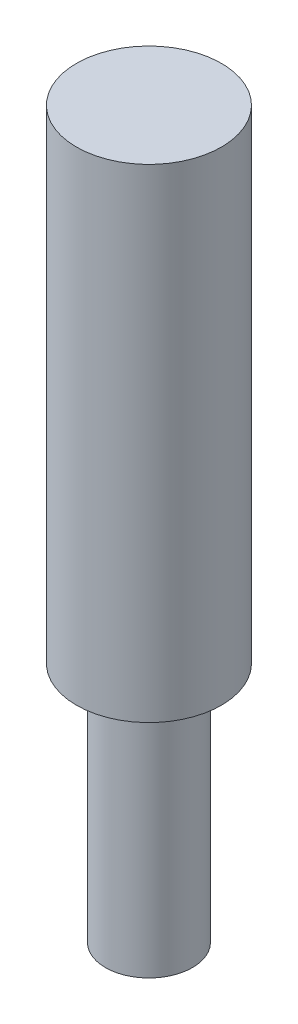
ISO-10303-21;
HEADER;
FILE_DESCRIPTION(('STEP AP214'),'2;1');
FILE_NAME('part.step','',(''),(''),'','','');
FILE_SCHEMA(('AUTOMOTIVE_DESIGN { 1 0 10303 214 1 1 1 1 }'));
ENDSEC;
DATA;
#1=APPLICATION_CONTEXT('core data for automotive mechanical design processes');
#2=APPLICATION_PROTOCOL_DEFINITION('international standard','automotive_design',2000,#1);
#3=PRODUCT_CONTEXT('',#1,'mechanical');
#4=PRODUCT('Part','Part','',(#3));
#5=PRODUCT_RELATED_PRODUCT_CATEGORY('part','',(#4));
#6=PRODUCT_DEFINITION_FORMATION('','',#4);
#7=PRODUCT_DEFINITION_CONTEXT('part definition',#1,'design');
#8=PRODUCT_DEFINITION('design','',#6,#7);
#9=PRODUCT_DEFINITION_SHAPE('','',#8);
#10=(LENGTH_UNIT() NAMED_UNIT(*) SI_UNIT(.MILLI.,.METRE.));
#11=(NAMED_UNIT(*) PLANE_ANGLE_UNIT() SI_UNIT($,.RADIAN.));
#12=(NAMED_UNIT(*) SI_UNIT($,.STERADIAN.) SOLID_ANGLE_UNIT());
#13=UNCERTAINTY_MEASURE_WITH_UNIT(LENGTH_MEASURE(1.E-05),#10,'distance_accuracy_value','');
#14=(GEOMETRIC_REPRESENTATION_CONTEXT(3) GLOBAL_UNCERTAINTY_ASSIGNED_CONTEXT((#13)) GLOBAL_UNIT_ASSIGNED_CONTEXT((#10,
#11,#12)) REPRESENTATION_CONTEXT('',''));
#15=CARTESIAN_POINT('',(0.,0.,0.));
#16=DIRECTION('',(0.,0.,1.));
#17=DIRECTION('',(1.,0.,0.));
#18=AXIS2_PLACEMENT_3D('',#15,#16,#17);
#19=CARTESIAN_POINT('',(0.,5.,0.));
#20=DIRECTION('',(0.,-1.,0.));
#21=DIRECTION('',(0.,0.,-1.));
#22=AXIS2_PLACEMENT_3D('',#19,#20,#21);
#23=CYLINDRICAL_SURFACE('',#22,0.9);
#24=CARTESIAN_POINT('',(0.,5.,0.));
#25=DIRECTION('',(0.,1.,0.));
#26=DIRECTION('',(0.,0.,1.));
#27=AXIS2_PLACEMENT_3D('',#24,#25,#26);
#28=CIRCLE('',#27,0.9);
#29=CARTESIAN_POINT('',(0.,5.,0.9));
#30=VERTEX_POINT('',#29);
#31=EDGE_CURVE('E10',#30,#30,#28,.T.);
#32=ORIENTED_EDGE('',*,*,#31,.F.);
#33=EDGE_LOOP('',(#32));
#34=FACE_BOUND('',#33,.T.);
#35=CARTESIAN_POINT('',(0.,0.,0.));
#36=DIRECTION('',(0.,1.,0.));
#37=DIRECTION('',(0.,0.,1.));
#38=AXIS2_PLACEMENT_3D('',#35,#36,#37);
#39=CIRCLE('',#38,0.9);
#40=CARTESIAN_POINT('',(0.,0.,0.9));
#41=VERTEX_POINT('',#40);
#42=EDGE_CURVE('E42',#41,#41,#39,.T.);
#43=ORIENTED_EDGE('',*,*,#42,.T.);
#44=EDGE_LOOP('',(#43));
#45=FACE_BOUND('',#44,.T.);
#46=ADVANCED_FACE('F39',(#34,#45),#23,.T.);
#47=CARTESIAN_POINT('',(0.,0.,0.));
#48=DIRECTION('',(0.,1.,0.));
#49=DIRECTION('',(0.,0.,1.));
#50=AXIS2_PLACEMENT_3D('',#47,#48,#49);
#51=PLANE('',#50);
#52=ORIENTED_EDGE('',*,*,#42,.F.);
#53=EDGE_LOOP('',(#52));
#54=FACE_BOUND('',#53,.T.);
#55=ADVANCED_FACE('F62',(#54),#51,.F.);
#56=CARTESIAN_POINT('',(0.,15.,0.));
#57=DIRECTION('',(0.,-1.,0.));
#58=DIRECTION('',(0.,0.,-1.));
#59=AXIS2_PLACEMENT_3D('',#56,#57,#58);
#60=CYLINDRICAL_SURFACE('',#59,1.5);
#61=CARTESIAN_POINT('',(0.,15.,0.));
#62=DIRECTION('',(0.,1.,0.));
#63=DIRECTION('',(0.,0.,1.));
#64=AXIS2_PLACEMENT_3D('',#61,#62,#63);
#65=CIRCLE('',#64,1.5);
#66=CARTESIAN_POINT('',(0.,15.,1.5));
#67=VERTEX_POINT('',#66);
#68=EDGE_CURVE('E49',#67,#67,#65,.T.);
#69=ORIENTED_EDGE('',*,*,#68,.F.);
#70=EDGE_LOOP('',(#69));
#71=FACE_BOUND('',#70,.T.);
#72=CARTESIAN_POINT('',(0.,5.,0.));
#73=DIRECTION('',(0.,1.,0.));
#74=DIRECTION('',(0.,0.,1.));
#75=AXIS2_PLACEMENT_3D('',#72,#73,#74);
#76=CIRCLE('',#75,1.5);
#77=CARTESIAN_POINT('',(0.,5.,1.5));
#78=VERTEX_POINT('',#77);
#79=EDGE_CURVE('E51',#78,#78,#76,.T.);
#80=ORIENTED_EDGE('',*,*,#79,.T.);
#81=EDGE_LOOP('',(#80));
#82=FACE_BOUND('',#81,.T.);
#83=ADVANCED_FACE('F59',(#71,#82),#60,.T.);
#84=CARTESIAN_POINT('',(0.,15.,0.));
#85=DIRECTION('',(0.,1.,0.));
#86=DIRECTION('',(0.,0.,1.));
#87=AXIS2_PLACEMENT_3D('',#84,#85,#86);
#88=PLANE('',#87);
#89=ORIENTED_EDGE('',*,*,#68,.T.);
#90=EDGE_LOOP('',(#89));
#91=FACE_BOUND('',#90,.T.);
#92=ADVANCED_FACE('F57',(#91),#88,.T.);
#93=CARTESIAN_POINT('',(0.,5.,0.));
#94=DIRECTION('',(0.,1.,0.));
#95=DIRECTION('',(0.,0.,1.));
#96=AXIS2_PLACEMENT_3D('',#93,#94,#95);
#97=PLANE('',#96);
#98=ORIENTED_EDGE('',*,*,#31,.T.);
#99=EDGE_LOOP('',(#98));
#100=FACE_BOUND('',#99,.T.);
#101=ORIENTED_EDGE('',*,*,#79,.F.);
#102=EDGE_LOOP('',(#101));
#103=FACE_BOUND('',#102,.T.);
#104=ADVANCED_FACE('F66',(#100,#103),#97,.F.);
#105=CLOSED_SHELL('',(#46,#55,#83,#92,#104));
#106=MANIFOLD_SOLID_BREP('B2',#105);
#107=ADVANCED_BREP_SHAPE_REPRESENTATION('',(#18,#106),#14);
#108=SHAPE_DEFINITION_REPRESENTATION(#9,#107);
ENDSEC;
END-ISO-10303-21;
